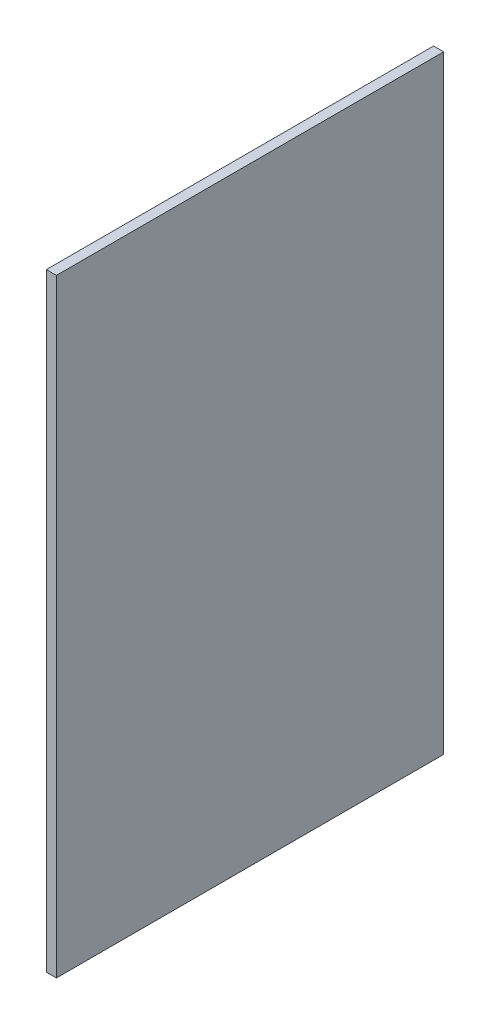
ISO-10303-21;
HEADER;
FILE_DESCRIPTION(('STEP AP214'),'2;1');
FILE_NAME('part.step','',(''),(''),'','','');
FILE_SCHEMA(('AUTOMOTIVE_DESIGN { 1 0 10303 214 1 1 1 1 }'));
ENDSEC;
DATA;
#1=APPLICATION_CONTEXT('core data for automotive mechanical design processes');
#2=APPLICATION_PROTOCOL_DEFINITION('international standard','automotive_design',2000,#1);
#3=PRODUCT_CONTEXT('',#1,'mechanical');
#4=PRODUCT('Part','Part','',(#3));
#5=PRODUCT_RELATED_PRODUCT_CATEGORY('part','',(#4));
#6=PRODUCT_DEFINITION_FORMATION('','',#4);
#7=PRODUCT_DEFINITION_CONTEXT('part definition',#1,'design');
#8=PRODUCT_DEFINITION('design','',#6,#7);
#9=PRODUCT_DEFINITION_SHAPE('','',#8);
#10=(LENGTH_UNIT() NAMED_UNIT(*) SI_UNIT(.MILLI.,.METRE.));
#11=(NAMED_UNIT(*) PLANE_ANGLE_UNIT() SI_UNIT($,.RADIAN.));
#12=(NAMED_UNIT(*) SI_UNIT($,.STERADIAN.) SOLID_ANGLE_UNIT());
#13=UNCERTAINTY_MEASURE_WITH_UNIT(LENGTH_MEASURE(1.E-05),#10,'distance_accuracy_value','');
#14=(GEOMETRIC_REPRESENTATION_CONTEXT(3) GLOBAL_UNCERTAINTY_ASSIGNED_CONTEXT((#13)) GLOBAL_UNIT_ASSIGNED_CONTEXT((#10,
#11,#12)) REPRESENTATION_CONTEXT('',''));
#15=CARTESIAN_POINT('',(0.,0.,0.));
#16=DIRECTION('',(0.,0.,1.));
#17=DIRECTION('',(1.,0.,0.));
#18=AXIS2_PLACEMENT_3D('',#15,#16,#17);
#19=CARTESIAN_POINT('',(0.,0.,77.));
#20=DIRECTION('',(0.,0.,1.));
#21=DIRECTION('',(1.,0.,0.));
#22=AXIS2_PLACEMENT_3D('',#19,#20,#21);
#23=PLANE('',#22);
#24=DIRECTION('',(0.,1.,0.));
#25=VECTOR('',#24,1.);
#26=CARTESIAN_POINT('',(0.,0.,77.));
#27=LINE('',#26,#25);
#28=CARTESIAN_POINT('',(0.,0.,77.));
#29=VERTEX_POINT('',#28);
#30=CARTESIAN_POINT('',(0.,121.,77.));
#31=VERTEX_POINT('',#30);
#32=EDGE_CURVE('E87',#29,#31,#27,.T.);
#33=ORIENTED_EDGE('',*,*,#32,.F.);
#34=DIRECTION('',(1.,0.,0.));
#35=VECTOR('',#34,1.);
#36=CARTESIAN_POINT('',(0.,0.,77.));
#37=LINE('',#36,#35);
#38=CARTESIAN_POINT('',(2.,0.,77.));
#39=VERTEX_POINT('',#38);
#40=EDGE_CURVE('E103',#29,#39,#37,.T.);
#41=ORIENTED_EDGE('',*,*,#40,.T.);
#42=DIRECTION('',(0.,1.,0.));
#43=VECTOR('',#42,1.);
#44=CARTESIAN_POINT('',(2.,0.,77.));
#45=LINE('',#44,#43);
#46=CARTESIAN_POINT('',(2.,121.,77.));
#47=VERTEX_POINT('',#46);
#48=EDGE_CURVE('E101',#39,#47,#45,.T.);
#49=ORIENTED_EDGE('',*,*,#48,.T.);
#50=DIRECTION('',(1.,0.,0.));
#51=VECTOR('',#50,1.);
#52=CARTESIAN_POINT('',(0.,121.,77.));
#53=LINE('',#52,#51);
#54=EDGE_CURVE('E9',#31,#47,#53,.T.);
#55=ORIENTED_EDGE('',*,*,#54,.F.);
#56=EDGE_LOOP('',(#33,#41,#49,#55));
#57=FACE_BOUND('',#56,.T.);
#58=ADVANCED_FACE('F14',(#57),#23,.T.);
#59=CARTESIAN_POINT('',(0.,0.,0.));
#60=DIRECTION('',(0.,0.,1.));
#61=DIRECTION('',(1.,0.,0.));
#62=AXIS2_PLACEMENT_3D('',#59,#60,#61);
#63=PLANE('',#62);
#64=DIRECTION('',(1.,0.,0.));
#65=VECTOR('',#64,1.);
#66=CARTESIAN_POINT('',(0.,121.,0.));
#67=LINE('',#66,#65);
#68=CARTESIAN_POINT('',(0.,121.,0.));
#69=VERTEX_POINT('',#68);
#70=CARTESIAN_POINT('',(2.,121.,0.));
#71=VERTEX_POINT('',#70);
#72=EDGE_CURVE('E24',#69,#71,#67,.T.);
#73=ORIENTED_EDGE('',*,*,#72,.T.);
#74=DIRECTION('',(0.,1.,0.));
#75=VECTOR('',#74,1.);
#76=CARTESIAN_POINT('',(2.,0.,0.));
#77=LINE('',#76,#75);
#78=CARTESIAN_POINT('',(2.,0.,0.));
#79=VERTEX_POINT('',#78);
#80=EDGE_CURVE('E96',#79,#71,#77,.T.);
#81=ORIENTED_EDGE('',*,*,#80,.F.);
#82=DIRECTION('',(1.,0.,0.));
#83=VECTOR('',#82,1.);
#84=CARTESIAN_POINT('',(0.,0.,0.));
#85=LINE('',#84,#83);
#86=CARTESIAN_POINT('',(0.,0.,0.));
#87=VERTEX_POINT('',#86);
#88=EDGE_CURVE('E75',#87,#79,#85,.T.);
#89=ORIENTED_EDGE('',*,*,#88,.F.);
#90=DIRECTION('',(0.,1.,0.));
#91=VECTOR('',#90,1.);
#92=CARTESIAN_POINT('',(0.,0.,0.));
#93=LINE('',#92,#91);
#94=EDGE_CURVE('E78',#87,#69,#93,.T.);
#95=ORIENTED_EDGE('',*,*,#94,.T.);
#96=EDGE_LOOP('',(#73,#81,#89,#95));
#97=FACE_BOUND('',#96,.T.);
#98=ADVANCED_FACE('F79',(#97),#63,.F.);
#99=CARTESIAN_POINT('',(0.,121.,0.));
#100=DIRECTION('',(0.,1.,0.));
#101=DIRECTION('',(1.,0.,0.));
#102=AXIS2_PLACEMENT_3D('',#99,#100,#101);
#103=PLANE('',#102);
#104=ORIENTED_EDGE('',*,*,#72,.F.);
#105=DIRECTION('',(0.,0.,1.));
#106=VECTOR('',#105,1.);
#107=CARTESIAN_POINT('',(0.,121.,0.));
#108=LINE('',#107,#106);
#109=EDGE_CURVE('E67',#69,#31,#108,.T.);
#110=ORIENTED_EDGE('',*,*,#109,.T.);
#111=ORIENTED_EDGE('',*,*,#54,.T.);
#112=DIRECTION('',(0.,0.,1.));
#113=VECTOR('',#112,1.);
#114=CARTESIAN_POINT('',(2.,121.,0.));
#115=LINE('',#114,#113);
#116=EDGE_CURVE('E70',#71,#47,#115,.T.);
#117=ORIENTED_EDGE('',*,*,#116,.F.);
#118=EDGE_LOOP('',(#104,#110,#111,#117));
#119=FACE_BOUND('',#118,.T.);
#120=ADVANCED_FACE('F65',(#119),#103,.T.);
#121=CARTESIAN_POINT('',(0.,0.,0.));
#122=DIRECTION('',(0.,1.,0.));
#123=DIRECTION('',(1.,0.,0.));
#124=AXIS2_PLACEMENT_3D('',#121,#122,#123);
#125=PLANE('',#124);
#126=DIRECTION('',(0.,0.,1.));
#127=VECTOR('',#126,1.);
#128=CARTESIAN_POINT('',(2.,0.,0.));
#129=LINE('',#128,#127);
#130=EDGE_CURVE('E17',#79,#39,#129,.T.);
#131=ORIENTED_EDGE('',*,*,#130,.T.);
#132=ORIENTED_EDGE('',*,*,#40,.F.);
#133=DIRECTION('',(0.,0.,1.));
#134=VECTOR('',#133,1.);
#135=CARTESIAN_POINT('',(0.,0.,0.));
#136=LINE('',#135,#134);
#137=EDGE_CURVE('E84',#87,#29,#136,.T.);
#138=ORIENTED_EDGE('',*,*,#137,.F.);
#139=ORIENTED_EDGE('',*,*,#88,.T.);
#140=EDGE_LOOP('',(#131,#132,#138,#139));
#141=FACE_BOUND('',#140,.T.);
#142=ADVANCED_FACE('F118',(#141),#125,.F.);
#143=CARTESIAN_POINT('',(2.,0.,0.));
#144=DIRECTION('',(1.,0.,0.));
#145=DIRECTION('',(0.,1.,0.));
#146=AXIS2_PLACEMENT_3D('',#143,#144,#145);
#147=PLANE('',#146);
#148=ORIENTED_EDGE('',*,*,#130,.F.);
#149=ORIENTED_EDGE('',*,*,#80,.T.);
#150=ORIENTED_EDGE('',*,*,#116,.T.);
#151=ORIENTED_EDGE('',*,*,#48,.F.);
#152=EDGE_LOOP('',(#148,#149,#150,#151));
#153=FACE_BOUND('',#152,.T.);
#154=ADVANCED_FACE('F117',(#153),#147,.T.);
#155=CARTESIAN_POINT('',(0.,0.,0.));
#156=DIRECTION('',(1.,0.,0.));
#157=DIRECTION('',(0.,1.,0.));
#158=AXIS2_PLACEMENT_3D('',#155,#156,#157);
#159=PLANE('',#158);
#160=ORIENTED_EDGE('',*,*,#32,.T.);
#161=ORIENTED_EDGE('',*,*,#109,.F.);
#162=ORIENTED_EDGE('',*,*,#94,.F.);
#163=ORIENTED_EDGE('',*,*,#137,.T.);
#164=EDGE_LOOP('',(#160,#161,#162,#163));
#165=FACE_BOUND('',#164,.T.);
#166=ADVANCED_FACE('F86',(#165),#159,.F.);
#167=CLOSED_SHELL('',(#58,#98,#120,#142,#154,#166));
#168=MANIFOLD_SOLID_BREP('B1',#167);
#169=ADVANCED_BREP_SHAPE_REPRESENTATION('',(#18,#168),#14);
#170=SHAPE_DEFINITION_REPRESENTATION(#9,#169);
ENDSEC;
END-ISO-10303-21;
